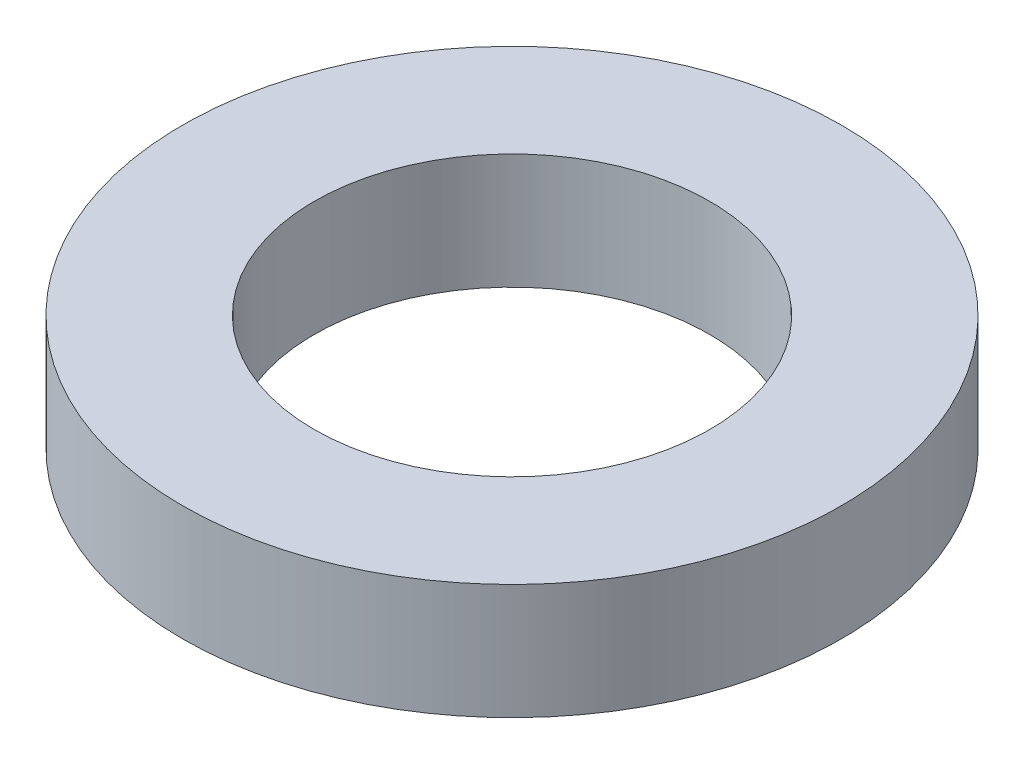
ISO-10303-21;
HEADER;
FILE_DESCRIPTION(('STEP AP214'),'2;1');
FILE_NAME('part.step','',(''),(''),'','','');
FILE_SCHEMA(('AUTOMOTIVE_DESIGN { 1 0 10303 214 1 1 1 1 }'));
ENDSEC;
DATA;
#1=APPLICATION_CONTEXT('core data for automotive mechanical design processes');
#2=APPLICATION_PROTOCOL_DEFINITION('international standard','automotive_design',2000,#1);
#3=PRODUCT_CONTEXT('',#1,'mechanical');
#4=PRODUCT('Part','Part','',(#3));
#5=PRODUCT_RELATED_PRODUCT_CATEGORY('part','',(#4));
#6=PRODUCT_DEFINITION_FORMATION('','',#4);
#7=PRODUCT_DEFINITION_CONTEXT('part definition',#1,'design');
#8=PRODUCT_DEFINITION('design','',#6,#7);
#9=PRODUCT_DEFINITION_SHAPE('','',#8);
#10=(LENGTH_UNIT() NAMED_UNIT(*) SI_UNIT(.MILLI.,.METRE.));
#11=(NAMED_UNIT(*) PLANE_ANGLE_UNIT() SI_UNIT($,.RADIAN.));
#12=(NAMED_UNIT(*) SI_UNIT($,.STERADIAN.) SOLID_ANGLE_UNIT());
#13=UNCERTAINTY_MEASURE_WITH_UNIT(LENGTH_MEASURE(1.E-05),#10,'distance_accuracy_value','');
#14=(GEOMETRIC_REPRESENTATION_CONTEXT(3) GLOBAL_UNCERTAINTY_ASSIGNED_CONTEXT((#13)) GLOBAL_UNIT_ASSIGNED_CONTEXT((#10,
#11,#12)) REPRESENTATION_CONTEXT('',''));
#15=CARTESIAN_POINT('',(0.,0.,0.));
#16=DIRECTION('',(0.,0.,1.));
#17=DIRECTION('',(1.,0.,0.));
#18=AXIS2_PLACEMENT_3D('',#15,#16,#17);
#19=CARTESIAN_POINT('',(0.,3.5,0.));
#20=DIRECTION('',(0.,1.,0.));
#21=DIRECTION('',(0.,0.,1.));
#22=AXIS2_PLACEMENT_3D('',#19,#20,#21);
#23=PLANE('',#22);
#24=CARTESIAN_POINT('',(0.,3.5,0.));
#25=DIRECTION('',(0.,1.,0.));
#26=DIRECTION('',(0.,0.,1.));
#27=AXIS2_PLACEMENT_3D('',#24,#25,#26);
#28=CIRCLE('',#27,10.);
#29=CARTESIAN_POINT('',(0.,3.5,10.));
#30=VERTEX_POINT('',#29);
#31=EDGE_CURVE('E10',#30,#30,#28,.T.);
#32=ORIENTED_EDGE('',*,*,#31,.T.);
#33=EDGE_LOOP('',(#32));
#34=FACE_BOUND('',#33,.T.);
#35=CARTESIAN_POINT('',(0.,3.5,0.));
#36=DIRECTION('',(0.,1.,0.));
#37=DIRECTION('',(0.,0.,1.));
#38=AXIS2_PLACEMENT_3D('',#35,#36,#37);
#39=CIRCLE('',#38,6.);
#40=CARTESIAN_POINT('',(0.,3.5,6.));
#41=VERTEX_POINT('',#40);
#42=EDGE_CURVE('E50',#41,#41,#39,.T.);
#43=ORIENTED_EDGE('',*,*,#42,.F.);
#44=EDGE_LOOP('',(#43));
#45=FACE_BOUND('',#44,.T.);
#46=ADVANCED_FACE('F39',(#34,#45),#23,.T.);
#47=CARTESIAN_POINT('',(0.,0.,0.));
#48=DIRECTION('',(0.,1.,0.));
#49=DIRECTION('',(0.,0.,1.));
#50=AXIS2_PLACEMENT_3D('',#47,#48,#49);
#51=PLANE('',#50);
#52=CARTESIAN_POINT('',(0.,0.,0.));
#53=DIRECTION('',(0.,1.,0.));
#54=DIRECTION('',(0.,0.,1.));
#55=AXIS2_PLACEMENT_3D('',#52,#53,#54);
#56=CIRCLE('',#55,10.);
#57=CARTESIAN_POINT('',(0.,0.,10.));
#58=VERTEX_POINT('',#57);
#59=EDGE_CURVE('E43',#58,#58,#56,.T.);
#60=ORIENTED_EDGE('',*,*,#59,.F.);
#61=EDGE_LOOP('',(#60));
#62=FACE_BOUND('',#61,.T.);
#63=CARTESIAN_POINT('',(0.,0.,0.));
#64=DIRECTION('',(0.,1.,0.));
#65=DIRECTION('',(0.,0.,1.));
#66=AXIS2_PLACEMENT_3D('',#63,#64,#65);
#67=CIRCLE('',#66,6.);
#68=CARTESIAN_POINT('',(0.,0.,6.));
#69=VERTEX_POINT('',#68);
#70=EDGE_CURVE('E52',#69,#69,#67,.T.);
#71=ORIENTED_EDGE('',*,*,#70,.T.);
#72=EDGE_LOOP('',(#71));
#73=FACE_BOUND('',#72,.T.);
#74=ADVANCED_FACE('F62',(#62,#73),#51,.F.);
#75=CARTESIAN_POINT('',(0.,3.5,0.));
#76=DIRECTION('',(0.,-1.,0.));
#77=DIRECTION('',(0.,0.,-1.));
#78=AXIS2_PLACEMENT_3D('',#75,#76,#77);
#79=CYLINDRICAL_SURFACE('',#78,10.);
#80=ORIENTED_EDGE('',*,*,#31,.F.);
#81=EDGE_LOOP('',(#80));
#82=FACE_BOUND('',#81,.T.);
#83=ORIENTED_EDGE('',*,*,#59,.T.);
#84=EDGE_LOOP('',(#83));
#85=FACE_BOUND('',#84,.T.);
#86=ADVANCED_FACE('F41',(#82,#85),#79,.T.);
#87=CARTESIAN_POINT('',(0.,3.5,0.));
#88=DIRECTION('',(0.,-1.,0.));
#89=DIRECTION('',(0.,0.,-1.));
#90=AXIS2_PLACEMENT_3D('',#87,#88,#89);
#91=CYLINDRICAL_SURFACE('',#90,6.);
#92=ORIENTED_EDGE('',*,*,#42,.T.);
#93=EDGE_LOOP('',(#92));
#94=FACE_BOUND('',#93,.T.);
#95=ORIENTED_EDGE('',*,*,#70,.F.);
#96=EDGE_LOOP('',(#95));
#97=FACE_BOUND('',#96,.T.);
#98=ADVANCED_FACE('F58',(#94,#97),#91,.F.);
#99=CLOSED_SHELL('',(#46,#74,#86,#98));
#100=MANIFOLD_SOLID_BREP('B2',#99);
#101=ADVANCED_BREP_SHAPE_REPRESENTATION('',(#18,#100),#14);
#102=SHAPE_DEFINITION_REPRESENTATION(#9,#101);
ENDSEC;
END-ISO-10303-21;
